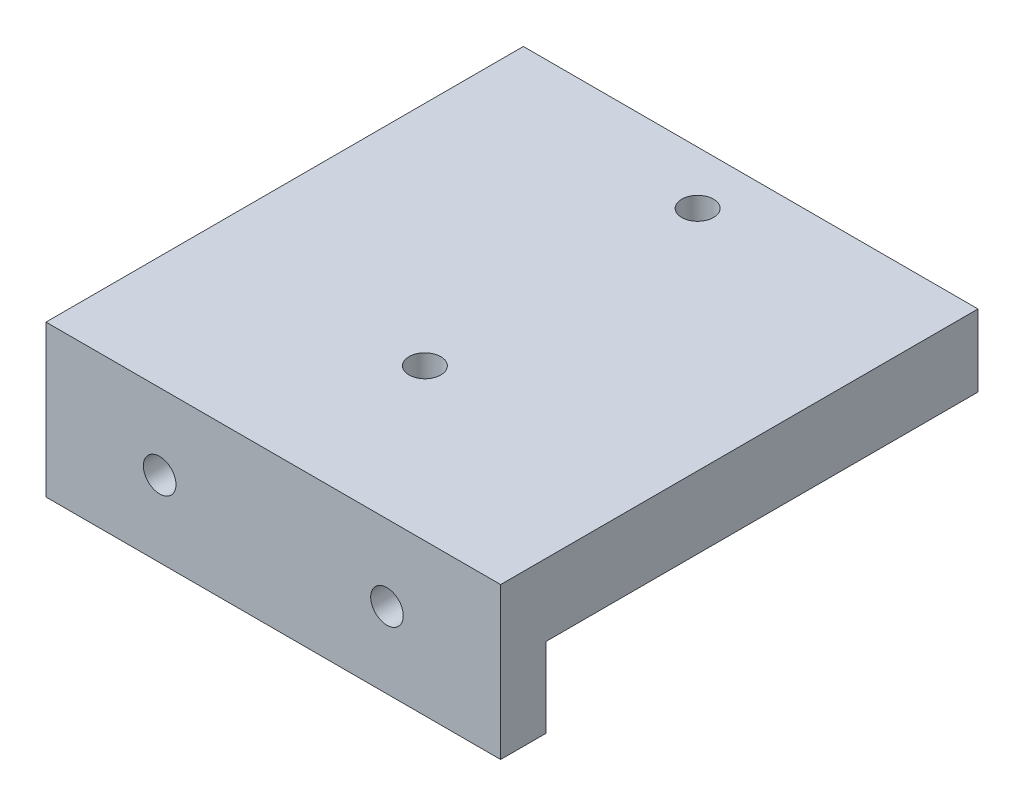
ISO-10303-21;
HEADER;
FILE_DESCRIPTION(('STEP AP214'),'2;1');
FILE_NAME('part.step','',(''),(''),'','','');
FILE_SCHEMA(('AUTOMOTIVE_DESIGN { 1 0 10303 214 1 1 1 1 }'));
ENDSEC;
DATA;
#1=APPLICATION_CONTEXT('core data for automotive mechanical design processes');
#2=APPLICATION_PROTOCOL_DEFINITION('international standard','automotive_design',2000,#1);
#3=PRODUCT_CONTEXT('',#1,'mechanical');
#4=PRODUCT('Part','Part','',(#3));
#5=PRODUCT_RELATED_PRODUCT_CATEGORY('part','',(#4));
#6=PRODUCT_DEFINITION_FORMATION('','',#4);
#7=PRODUCT_DEFINITION_CONTEXT('part definition',#1,'design');
#8=PRODUCT_DEFINITION('design','',#6,#7);
#9=PRODUCT_DEFINITION_SHAPE('','',#8);
#10=(LENGTH_UNIT() NAMED_UNIT(*) SI_UNIT(.MILLI.,.METRE.));
#11=(NAMED_UNIT(*) PLANE_ANGLE_UNIT() SI_UNIT($,.RADIAN.));
#12=(NAMED_UNIT(*) SI_UNIT($,.STERADIAN.) SOLID_ANGLE_UNIT());
#13=UNCERTAINTY_MEASURE_WITH_UNIT(LENGTH_MEASURE(1.E-05),#10,'distance_accuracy_value','');
#14=(GEOMETRIC_REPRESENTATION_CONTEXT(3) GLOBAL_UNCERTAINTY_ASSIGNED_CONTEXT((#13)) GLOBAL_UNIT_ASSIGNED_CONTEXT((#10,
#11,#12)) REPRESENTATION_CONTEXT('',''));
#15=CARTESIAN_POINT('',(0.,0.,0.));
#16=DIRECTION('',(0.,0.,1.));
#17=DIRECTION('',(1.,0.,0.));
#18=AXIS2_PLACEMENT_3D('',#15,#16,#17);
#19=CARTESIAN_POINT('',(-30.,23.5,-25.));
#20=DIRECTION('',(1.,0.,0.));
#21=DIRECTION('',(0.,0.,-1.));
#22=AXIS2_PLACEMENT_3D('',#19,#20,#21);
#23=PLANE('',#22);
#24=DIRECTION('',(0.,0.,1.));
#25=VECTOR('',#24,1.);
#26=CARTESIAN_POINT('',(-30.,14.,-25.));
#27=LINE('',#26,#25);
#28=CARTESIAN_POINT('',(-30.,14.,-25.));
#29=VERTEX_POINT('',#28);
#30=CARTESIAN_POINT('',(-30.,14.,32.));
#31=VERTEX_POINT('',#30);
#32=EDGE_CURVE('E161',#29,#31,#27,.T.);
#33=ORIENTED_EDGE('',*,*,#32,.T.);
#34=DIRECTION('',(0.,-1.,0.));
#35=VECTOR('',#34,1.);
#36=CARTESIAN_POINT('',(-30.,14.,32.));
#37=LINE('',#36,#35);
#38=CARTESIAN_POINT('',(-30.,3.5,32.));
#39=VERTEX_POINT('',#38);
#40=EDGE_CURVE('E150',#31,#39,#37,.T.);
#41=ORIENTED_EDGE('',*,*,#40,.T.);
#42=DIRECTION('',(0.,0.,1.));
#43=VECTOR('',#42,1.);
#44=CARTESIAN_POINT('',(-30.,3.5,32.));
#45=LINE('',#44,#43);
#46=CARTESIAN_POINT('',(-30.,3.5,38.));
#47=VERTEX_POINT('',#46);
#48=EDGE_CURVE('E141',#39,#47,#45,.T.);
#49=ORIENTED_EDGE('',*,*,#48,.T.);
#50=DIRECTION('',(0.,-1.,0.));
#51=VECTOR('',#50,1.);
#52=CARTESIAN_POINT('',(-30.,23.5,38.));
#53=LINE('',#52,#51);
#54=CARTESIAN_POINT('',(-30.,23.5,38.));
#55=VERTEX_POINT('',#54);
#56=EDGE_CURVE('E190',#55,#47,#53,.T.);
#57=ORIENTED_EDGE('',*,*,#56,.F.);
#58=DIRECTION('',(0.,0.,1.));
#59=VECTOR('',#58,1.);
#60=CARTESIAN_POINT('',(-30.,23.5,-25.));
#61=LINE('',#60,#59);
#62=CARTESIAN_POINT('',(-30.,23.5,-25.));
#63=VERTEX_POINT('',#62);
#64=EDGE_CURVE('E165',#63,#55,#61,.T.);
#65=ORIENTED_EDGE('',*,*,#64,.F.);
#66=DIRECTION('',(0.,-1.,0.));
#67=VECTOR('',#66,1.);
#68=CARTESIAN_POINT('',(-30.,23.5,-25.));
#69=LINE('',#68,#67);
#70=EDGE_CURVE('E172',#63,#29,#69,.T.);
#71=ORIENTED_EDGE('',*,*,#70,.T.);
#72=EDGE_LOOP('',(#33,#41,#49,#57,#65,#71));
#73=FACE_BOUND('',#72,.T.);
#74=ADVANCED_FACE('F39',(#73),#23,.F.);
#75=CARTESIAN_POINT('',(-30.,23.5,38.));
#76=DIRECTION('',(0.,0.,-1.));
#77=DIRECTION('',(-1.,0.,0.));
#78=AXIS2_PLACEMENT_3D('',#75,#76,#77);
#79=PLANE('',#78);
#80=CARTESIAN_POINT('',(15.,13.5,38.));
#81=DIRECTION('',(0.,0.,1.));
#82=DIRECTION('',(1.,0.,0.));
#83=AXIS2_PLACEMENT_3D('',#80,#81,#82);
#84=CIRCLE('',#83,2.15);
#85=CARTESIAN_POINT('',(17.15,13.5,38.));
#86=VERTEX_POINT('',#85);
#87=EDGE_CURVE('E137',#86,#86,#84,.T.);
#88=ORIENTED_EDGE('',*,*,#87,.F.);
#89=EDGE_LOOP('',(#88));
#90=FACE_BOUND('',#89,.T.);
#91=CARTESIAN_POINT('',(-15.,13.5,38.));
#92=DIRECTION('',(0.,0.,1.));
#93=DIRECTION('',(1.,0.,0.));
#94=AXIS2_PLACEMENT_3D('',#91,#92,#93);
#95=CIRCLE('',#94,2.15);
#96=CARTESIAN_POINT('',(-12.85,13.5,38.));
#97=VERTEX_POINT('',#96);
#98=EDGE_CURVE('E124',#97,#97,#95,.T.);
#99=ORIENTED_EDGE('',*,*,#98,.F.);
#100=EDGE_LOOP('',(#99));
#101=FACE_BOUND('',#100,.T.);
#102=ORIENTED_EDGE('',*,*,#56,.T.);
#103=DIRECTION('',(1.,0.,0.));
#104=VECTOR('',#103,1.);
#105=CARTESIAN_POINT('',(-30.,3.5,38.));
#106=LINE('',#105,#104);
#107=CARTESIAN_POINT('',(30.,3.5,38.));
#108=VERTEX_POINT('',#107);
#109=EDGE_CURVE('E151',#47,#108,#106,.T.);
#110=ORIENTED_EDGE('',*,*,#109,.T.);
#111=DIRECTION('',(0.,-1.,0.));
#112=VECTOR('',#111,1.);
#113=CARTESIAN_POINT('',(30.,23.5,38.));
#114=LINE('',#113,#112);
#115=CARTESIAN_POINT('',(30.,23.5,38.));
#116=VERTEX_POINT('',#115);
#117=EDGE_CURVE('E184',#116,#108,#114,.T.);
#118=ORIENTED_EDGE('',*,*,#117,.F.);
#119=DIRECTION('',(1.,0.,0.));
#120=VECTOR('',#119,1.);
#121=CARTESIAN_POINT('',(-30.,23.5,38.));
#122=LINE('',#121,#120);
#123=EDGE_CURVE('E170',#55,#116,#122,.T.);
#124=ORIENTED_EDGE('',*,*,#123,.F.);
#125=EDGE_LOOP('',(#102,#110,#118,#124));
#126=FACE_BOUND('',#125,.T.);
#127=ADVANCED_FACE('F214',(#90,#101,#126),#79,.F.);
#128=CARTESIAN_POINT('',(30.,23.5,-25.));
#129=DIRECTION('',(-1.,0.,0.));
#130=DIRECTION('',(0.,0.,1.));
#131=AXIS2_PLACEMENT_3D('',#128,#129,#130);
#132=PLANE('',#131);
#133=ORIENTED_EDGE('',*,*,#117,.T.);
#134=DIRECTION('',(0.,0.,-1.));
#135=VECTOR('',#134,1.);
#136=CARTESIAN_POINT('',(30.,3.5,32.));
#137=LINE('',#136,#135);
#138=CARTESIAN_POINT('',(30.,3.5,32.));
#139=VERTEX_POINT('',#138);
#140=EDGE_CURVE('E153',#108,#139,#137,.T.);
#141=ORIENTED_EDGE('',*,*,#140,.T.);
#142=DIRECTION('',(0.,-1.,0.));
#143=VECTOR('',#142,1.);
#144=CARTESIAN_POINT('',(30.,14.,32.));
#145=LINE('',#144,#143);
#146=CARTESIAN_POINT('',(30.,14.,32.));
#147=VERTEX_POINT('',#146);
#148=EDGE_CURVE('E158',#147,#139,#145,.T.);
#149=ORIENTED_EDGE('',*,*,#148,.F.);
#150=DIRECTION('',(0.,0.,-1.));
#151=VECTOR('',#150,1.);
#152=CARTESIAN_POINT('',(30.,14.,-25.));
#153=LINE('',#152,#151);
#154=CARTESIAN_POINT('',(30.,14.,-25.));
#155=VERTEX_POINT('',#154);
#156=EDGE_CURVE('E180',#147,#155,#153,.T.);
#157=ORIENTED_EDGE('',*,*,#156,.T.);
#158=DIRECTION('',(0.,-1.,0.));
#159=VECTOR('',#158,1.);
#160=CARTESIAN_POINT('',(30.,23.5,-25.));
#161=LINE('',#160,#159);
#162=CARTESIAN_POINT('',(30.,23.5,-25.));
#163=VERTEX_POINT('',#162);
#164=EDGE_CURVE('E185',#163,#155,#161,.T.);
#165=ORIENTED_EDGE('',*,*,#164,.F.);
#166=DIRECTION('',(0.,0.,-1.));
#167=VECTOR('',#166,1.);
#168=CARTESIAN_POINT('',(30.,23.5,-25.));
#169=LINE('',#168,#167);
#170=EDGE_CURVE('E167',#116,#163,#169,.T.);
#171=ORIENTED_EDGE('',*,*,#170,.F.);
#172=EDGE_LOOP('',(#133,#141,#149,#157,#165,#171));
#173=FACE_BOUND('',#172,.T.);
#174=ADVANCED_FACE('F198',(#173),#132,.F.);
#175=CARTESIAN_POINT('',(-30.,23.5,-25.));
#176=DIRECTION('',(0.,0.,1.));
#177=DIRECTION('',(1.,0.,0.));
#178=AXIS2_PLACEMENT_3D('',#175,#176,#177);
#179=PLANE('',#178);
#180=DIRECTION('',(-1.,0.,0.));
#181=VECTOR('',#180,1.);
#182=CARTESIAN_POINT('',(-30.,14.,-25.));
#183=LINE('',#182,#181);
#184=EDGE_CURVE('E166',#155,#29,#183,.T.);
#185=ORIENTED_EDGE('',*,*,#184,.T.);
#186=ORIENTED_EDGE('',*,*,#70,.F.);
#187=DIRECTION('',(-1.,0.,0.));
#188=VECTOR('',#187,1.);
#189=CARTESIAN_POINT('',(-30.,23.5,-25.));
#190=LINE('',#189,#188);
#191=EDGE_CURVE('E175',#163,#63,#190,.T.);
#192=ORIENTED_EDGE('',*,*,#191,.F.);
#193=ORIENTED_EDGE('',*,*,#164,.T.);
#194=EDGE_LOOP('',(#185,#186,#192,#193));
#195=FACE_BOUND('',#194,.T.);
#196=ADVANCED_FACE('F205',(#195),#179,.F.);
#197=CARTESIAN_POINT('',(0.,23.5,0.));
#198=DIRECTION('',(0.,1.,0.));
#199=DIRECTION('',(0.,0.,1.));
#200=AXIS2_PLACEMENT_3D('',#197,#198,#199);
#201=PLANE('',#200);
#202=CARTESIAN_POINT('',(0.,23.5,18.));
#203=DIRECTION('',(0.,1.,0.));
#204=DIRECTION('',(0.,0.,1.));
#205=AXIS2_PLACEMENT_3D('',#202,#203,#204);
#206=CIRCLE('',#205,2.1);
#207=CARTESIAN_POINT('',(0.,23.5,20.1));
#208=VERTEX_POINT('',#207);
#209=EDGE_CURVE('E121',#208,#208,#206,.T.);
#210=ORIENTED_EDGE('',*,*,#209,.F.);
#211=EDGE_LOOP('',(#210));
#212=FACE_BOUND('',#211,.T.);
#213=CARTESIAN_POINT('',(0.,23.5,-18.));
#214=DIRECTION('',(0.,1.,0.));
#215=DIRECTION('',(0.,0.,1.));
#216=AXIS2_PLACEMENT_3D('',#213,#214,#215);
#217=CIRCLE('',#216,2.1);
#218=CARTESIAN_POINT('',(0.,23.5,-15.9));
#219=VERTEX_POINT('',#218);
#220=EDGE_CURVE('E287',#219,#219,#217,.T.);
#221=ORIENTED_EDGE('',*,*,#220,.F.);
#222=EDGE_LOOP('',(#221));
#223=FACE_BOUND('',#222,.T.);
#224=ORIENTED_EDGE('',*,*,#64,.T.);
#225=ORIENTED_EDGE('',*,*,#123,.T.);
#226=ORIENTED_EDGE('',*,*,#170,.T.);
#227=ORIENTED_EDGE('',*,*,#191,.T.);
#228=EDGE_LOOP('',(#224,#225,#226,#227));
#229=FACE_BOUND('',#228,.T.);
#230=ADVANCED_FACE('F210',(#212,#223,#229),#201,.T.);
#231=CARTESIAN_POINT('',(0.,14.,0.));
#232=DIRECTION('',(0.,1.,0.));
#233=DIRECTION('',(0.,0.,1.));
#234=AXIS2_PLACEMENT_3D('',#231,#232,#233);
#235=PLANE('',#234);
#236=CARTESIAN_POINT('',(18.,14.,0.));
#237=DIRECTION('',(0.,1.,0.));
#238=DIRECTION('',(0.,0.,1.));
#239=AXIS2_PLACEMENT_3D('',#236,#237,#238);
#240=CIRCLE('',#239,5.);
#241=CARTESIAN_POINT('',(18.,14.,5.));
#242=VERTEX_POINT('',#241);
#243=EDGE_CURVE('E289',#242,#242,#240,.T.);
#244=ORIENTED_EDGE('',*,*,#243,.T.);
#245=EDGE_LOOP('',(#244));
#246=FACE_BOUND('',#245,.T.);
#247=CARTESIAN_POINT('',(-18.,14.,0.));
#248=DIRECTION('',(0.,1.,0.));
#249=DIRECTION('',(0.,0.,1.));
#250=AXIS2_PLACEMENT_3D('',#247,#248,#249);
#251=CIRCLE('',#250,5.);
#252=CARTESIAN_POINT('',(-18.,14.,5.));
#253=VERTEX_POINT('',#252);
#254=EDGE_CURVE('E291',#253,#253,#251,.T.);
#255=ORIENTED_EDGE('',*,*,#254,.T.);
#256=EDGE_LOOP('',(#255));
#257=FACE_BOUND('',#256,.T.);
#258=CARTESIAN_POINT('',(0.,14.,18.));
#259=DIRECTION('',(0.,1.,0.));
#260=DIRECTION('',(0.,0.,1.));
#261=AXIS2_PLACEMENT_3D('',#258,#259,#260);
#262=CIRCLE('',#261,2.1);
#263=CARTESIAN_POINT('',(0.,14.,20.1));
#264=VERTEX_POINT('',#263);
#265=EDGE_CURVE('E303',#264,#264,#262,.T.);
#266=ORIENTED_EDGE('',*,*,#265,.T.);
#267=EDGE_LOOP('',(#266));
#268=FACE_BOUND('',#267,.T.);
#269=CARTESIAN_POINT('',(0.,14.,-18.));
#270=DIRECTION('',(0.,1.,0.));
#271=DIRECTION('',(0.,0.,1.));
#272=AXIS2_PLACEMENT_3D('',#269,#270,#271);
#273=CIRCLE('',#272,2.1);
#274=CARTESIAN_POINT('',(0.,14.,-15.9));
#275=VERTEX_POINT('',#274);
#276=EDGE_CURVE('E288',#275,#275,#273,.T.);
#277=ORIENTED_EDGE('',*,*,#276,.T.);
#278=EDGE_LOOP('',(#277));
#279=FACE_BOUND('',#278,.T.);
#280=DIRECTION('',(1.,0.,0.));
#281=VECTOR('',#280,1.);
#282=CARTESIAN_POINT('',(0.,14.,30.));
#283=LINE('',#282,#281);
#284=CARTESIAN_POINT('',(12.9089476333674,14.,30.));
#285=VERTEX_POINT('',#284);
#286=CARTESIAN_POINT('',(17.0910523666326,14.,30.));
#287=VERTEX_POINT('',#286);
#288=EDGE_CURVE('E11',#285,#287,#283,.T.);
#289=ORIENTED_EDGE('',*,*,#288,.F.);
#290=DIRECTION('',(0.,0.,1.));
#291=VECTOR('',#290,1.);
#292=CARTESIAN_POINT('',(12.9089476333674,14.,30.));
#293=LINE('',#292,#291);
#294=CARTESIAN_POINT('',(12.9089476333674,14.,32.));
#295=VERTEX_POINT('',#294);
#296=EDGE_CURVE('E142',#285,#295,#293,.T.);
#297=ORIENTED_EDGE('',*,*,#296,.T.);
#298=DIRECTION('',(-1.,0.,0.));
#299=VECTOR('',#298,1.);
#300=CARTESIAN_POINT('',(-30.,14.,32.));
#301=LINE('',#300,#299);
#302=CARTESIAN_POINT('',(-12.9089476333674,14.,32.));
#303=VERTEX_POINT('',#302);
#304=EDGE_CURVE('E131',#295,#303,#301,.T.);
#305=ORIENTED_EDGE('',*,*,#304,.T.);
#306=DIRECTION('',(0.,0.,1.));
#307=VECTOR('',#306,1.);
#308=CARTESIAN_POINT('',(-12.9089476333674,14.,30.));
#309=LINE('',#308,#307);
#310=CARTESIAN_POINT('',(-12.9089476333674,14.,30.));
#311=VERTEX_POINT('',#310);
#312=EDGE_CURVE('E52',#303,#311,#309,.F.);
#313=ORIENTED_EDGE('',*,*,#312,.T.);
#314=DIRECTION('',(1.,0.,0.));
#315=VECTOR('',#314,1.);
#316=CARTESIAN_POINT('',(0.,14.,30.));
#317=LINE('',#316,#315);
#318=CARTESIAN_POINT('',(-17.0910523666326,14.,30.));
#319=VERTEX_POINT('',#318);
#320=EDGE_CURVE('E46',#319,#311,#317,.T.);
#321=ORIENTED_EDGE('',*,*,#320,.F.);
#322=DIRECTION('',(0.,0.,1.));
#323=VECTOR('',#322,1.);
#324=CARTESIAN_POINT('',(-17.0910523666326,14.,30.));
#325=LINE('',#324,#323);
#326=CARTESIAN_POINT('',(-17.0910523666326,14.,32.));
#327=VERTEX_POINT('',#326);
#328=EDGE_CURVE('E125',#319,#327,#325,.T.);
#329=ORIENTED_EDGE('',*,*,#328,.T.);
#330=EDGE_CURVE('E149',#327,#31,#301,.T.);
#331=ORIENTED_EDGE('',*,*,#330,.T.);
#332=ORIENTED_EDGE('',*,*,#32,.F.);
#333=ORIENTED_EDGE('',*,*,#184,.F.);
#334=ORIENTED_EDGE('',*,*,#156,.F.);
#335=CARTESIAN_POINT('',(17.0910523666326,14.,32.));
#336=VERTEX_POINT('',#335);
#337=EDGE_CURVE('E144',#147,#336,#301,.T.);
#338=ORIENTED_EDGE('',*,*,#337,.T.);
#339=DIRECTION('',(0.,0.,1.));
#340=VECTOR('',#339,1.);
#341=CARTESIAN_POINT('',(17.0910523666326,14.,30.));
#342=LINE('',#341,#340);
#343=EDGE_CURVE('E62',#336,#287,#342,.F.);
#344=ORIENTED_EDGE('',*,*,#343,.T.);
#345=EDGE_LOOP('',(#289,#297,#305,#313,#321,#329,#331,#332,#333,#334,#338,#344));
#346=FACE_BOUND('',#345,.T.);
#347=ADVANCED_FACE('F129',(#246,#257,#268,#279,#346),#235,.F.);
#348=CARTESIAN_POINT('',(-30.,14.,32.));
#349=DIRECTION('',(0.,0.,1.));
#350=DIRECTION('',(1.,0.,0.));
#351=AXIS2_PLACEMENT_3D('',#348,#349,#350);
#352=PLANE('',#351);
#353=ORIENTED_EDGE('',*,*,#304,.F.);
#354=CARTESIAN_POINT('',(15.,13.5,32.));
#355=DIRECTION('',(0.,0.,1.));
#356=DIRECTION('',(1.,0.,0.));
#357=AXIS2_PLACEMENT_3D('',#354,#355,#356);
#358=CIRCLE('',#357,2.15);
#359=EDGE_CURVE('E119',#295,#336,#358,.T.);
#360=ORIENTED_EDGE('',*,*,#359,.T.);
#361=ORIENTED_EDGE('',*,*,#337,.F.);
#362=ORIENTED_EDGE('',*,*,#148,.T.);
#363=DIRECTION('',(-1.,0.,0.));
#364=VECTOR('',#363,1.);
#365=CARTESIAN_POINT('',(-30.,3.5,32.));
#366=LINE('',#365,#364);
#367=EDGE_CURVE('E157',#139,#39,#366,.T.);
#368=ORIENTED_EDGE('',*,*,#367,.T.);
#369=ORIENTED_EDGE('',*,*,#40,.F.);
#370=ORIENTED_EDGE('',*,*,#330,.F.);
#371=CARTESIAN_POINT('',(-15.,13.5,32.));
#372=DIRECTION('',(0.,0.,1.));
#373=DIRECTION('',(1.,0.,0.));
#374=AXIS2_PLACEMENT_3D('',#371,#372,#373);
#375=CIRCLE('',#374,2.15);
#376=EDGE_CURVE('E186',#327,#303,#375,.T.);
#377=ORIENTED_EDGE('',*,*,#376,.T.);
#378=EDGE_LOOP('',(#353,#360,#361,#362,#368,#369,#370,#377));
#379=FACE_BOUND('',#378,.T.);
#380=ADVANCED_FACE('F194',(#379),#352,.F.);
#381=CARTESIAN_POINT('',(0.,3.5,0.));
#382=DIRECTION('',(0.,1.,0.));
#383=DIRECTION('',(0.,0.,1.));
#384=AXIS2_PLACEMENT_3D('',#381,#382,#383);
#385=PLANE('',#384);
#386=ORIENTED_EDGE('',*,*,#48,.F.);
#387=ORIENTED_EDGE('',*,*,#367,.F.);
#388=ORIENTED_EDGE('',*,*,#140,.F.);
#389=ORIENTED_EDGE('',*,*,#109,.F.);
#390=EDGE_LOOP('',(#386,#387,#388,#389));
#391=FACE_BOUND('',#390,.T.);
#392=ADVANCED_FACE('F217',(#391),#385,.F.);
#393=CARTESIAN_POINT('',(-15.,13.5,30.));
#394=DIRECTION('',(0.,0.,1.));
#395=DIRECTION('',(1.,0.,0.));
#396=AXIS2_PLACEMENT_3D('',#393,#394,#395);
#397=PLANE('',#396);
#398=ORIENTED_EDGE('',*,*,#320,.T.);
#399=CARTESIAN_POINT('',(-15.,13.5,30.));
#400=DIRECTION('',(0.,0.,1.));
#401=DIRECTION('',(1.,0.,0.));
#402=AXIS2_PLACEMENT_3D('',#399,#400,#401);
#403=CIRCLE('',#402,2.15);
#404=EDGE_CURVE('E120',#311,#319,#403,.T.);
#405=ORIENTED_EDGE('',*,*,#404,.T.);
#406=EDGE_LOOP('',(#398,#405));
#407=FACE_BOUND('',#406,.T.);
#408=ADVANCED_FACE('F116',(#407),#397,.T.);
#409=CARTESIAN_POINT('',(-15.,13.5,30.));
#410=DIRECTION('',(0.,0.,1.));
#411=DIRECTION('',(1.,0.,0.));
#412=AXIS2_PLACEMENT_3D('',#409,#410,#411);
#413=CYLINDRICAL_SURFACE('',#412,2.15);
#414=ORIENTED_EDGE('',*,*,#98,.T.);
#415=EDGE_LOOP('',(#414));
#416=FACE_BOUND('',#415,.T.);
#417=ORIENTED_EDGE('',*,*,#404,.F.);
#418=ORIENTED_EDGE('',*,*,#312,.F.);
#419=ORIENTED_EDGE('',*,*,#376,.F.);
#420=ORIENTED_EDGE('',*,*,#328,.F.);
#421=EDGE_LOOP('',(#417,#418,#419,#420));
#422=FACE_BOUND('',#421,.T.);
#423=ADVANCED_FACE('F122',(#416,#422),#413,.F.);
#424=CARTESIAN_POINT('',(15.,13.5,30.));
#425=DIRECTION('',(0.,0.,1.));
#426=DIRECTION('',(1.,0.,0.));
#427=AXIS2_PLACEMENT_3D('',#424,#425,#426);
#428=PLANE('',#427);
#429=ORIENTED_EDGE('',*,*,#288,.T.);
#430=CARTESIAN_POINT('',(15.,13.5,30.));
#431=DIRECTION('',(0.,0.,1.));
#432=DIRECTION('',(1.,0.,0.));
#433=AXIS2_PLACEMENT_3D('',#430,#431,#432);
#434=CIRCLE('',#433,2.15);
#435=EDGE_CURVE('E132',#287,#285,#434,.T.);
#436=ORIENTED_EDGE('',*,*,#435,.T.);
#437=EDGE_LOOP('',(#429,#436));
#438=FACE_BOUND('',#437,.T.);
#439=ADVANCED_FACE('F248',(#438),#428,.T.);
#440=CARTESIAN_POINT('',(15.,13.5,30.));
#441=DIRECTION('',(0.,0.,1.));
#442=DIRECTION('',(1.,0.,0.));
#443=AXIS2_PLACEMENT_3D('',#440,#441,#442);
#444=CYLINDRICAL_SURFACE('',#443,2.15);
#445=ORIENTED_EDGE('',*,*,#87,.T.);
#446=EDGE_LOOP('',(#445));
#447=FACE_BOUND('',#446,.T.);
#448=ORIENTED_EDGE('',*,*,#435,.F.);
#449=ORIENTED_EDGE('',*,*,#343,.F.);
#450=ORIENTED_EDGE('',*,*,#359,.F.);
#451=ORIENTED_EDGE('',*,*,#296,.F.);
#452=EDGE_LOOP('',(#448,#449,#450,#451));
#453=FACE_BOUND('',#452,.T.);
#454=ADVANCED_FACE('F252',(#447,#453),#444,.F.);
#455=CARTESIAN_POINT('',(0.,23.5,-18.));
#456=DIRECTION('',(0.,-1.,0.));
#457=DIRECTION('',(0.,0.,-1.));
#458=AXIS2_PLACEMENT_3D('',#455,#456,#457);
#459=CYLINDRICAL_SURFACE('',#458,2.1);
#460=ORIENTED_EDGE('',*,*,#220,.T.);
#461=EDGE_LOOP('',(#460));
#462=FACE_BOUND('',#461,.T.);
#463=ORIENTED_EDGE('',*,*,#276,.F.);
#464=EDGE_LOOP('',(#463));
#465=FACE_BOUND('',#464,.T.);
#466=ADVANCED_FACE('F251',(#462,#465),#459,.F.);
#467=CARTESIAN_POINT('',(0.,23.5,18.));
#468=DIRECTION('',(0.,-1.,0.));
#469=DIRECTION('',(0.,0.,-1.));
#470=AXIS2_PLACEMENT_3D('',#467,#468,#469);
#471=CYLINDRICAL_SURFACE('',#470,2.1);
#472=ORIENTED_EDGE('',*,*,#209,.T.);
#473=EDGE_LOOP('',(#472));
#474=FACE_BOUND('',#473,.T.);
#475=ORIENTED_EDGE('',*,*,#265,.F.);
#476=EDGE_LOOP('',(#475));
#477=FACE_BOUND('',#476,.T.);
#478=ADVANCED_FACE('F261',(#474,#477),#471,.F.);
#479=CARTESIAN_POINT('',(-18.,19.,0.));
#480=DIRECTION('',(0.,-1.,0.));
#481=DIRECTION('',(0.,0.,-1.));
#482=AXIS2_PLACEMENT_3D('',#479,#480,#481);
#483=CYLINDRICAL_SURFACE('',#482,5.);
#484=CARTESIAN_POINT('',(-18.,19.,0.));
#485=DIRECTION('',(0.,1.,0.));
#486=DIRECTION('',(0.,0.,1.));
#487=AXIS2_PLACEMENT_3D('',#484,#485,#486);
#488=CIRCLE('',#487,5.);
#489=CARTESIAN_POINT('',(-18.,19.,5.));
#490=VERTEX_POINT('',#489);
#491=EDGE_CURVE('E296',#490,#490,#488,.T.);
#492=ORIENTED_EDGE('',*,*,#491,.T.);
#493=EDGE_LOOP('',(#492));
#494=FACE_BOUND('',#493,.T.);
#495=ORIENTED_EDGE('',*,*,#254,.F.);
#496=EDGE_LOOP('',(#495));
#497=FACE_BOUND('',#496,.T.);
#498=ADVANCED_FACE('F265',(#494,#497),#483,.F.);
#499=CARTESIAN_POINT('',(-18.,19.,0.));
#500=DIRECTION('',(0.,1.,0.));
#501=DIRECTION('',(0.,0.,1.));
#502=AXIS2_PLACEMENT_3D('',#499,#500,#501);
#503=PLANE('',#502);
#504=ORIENTED_EDGE('',*,*,#491,.F.);
#505=EDGE_LOOP('',(#504));
#506=FACE_BOUND('',#505,.T.);
#507=ADVANCED_FACE('F269',(#506),#503,.F.);
#508=CARTESIAN_POINT('',(18.,19.,0.));
#509=DIRECTION('',(0.,-1.,0.));
#510=DIRECTION('',(0.,0.,-1.));
#511=AXIS2_PLACEMENT_3D('',#508,#509,#510);
#512=CYLINDRICAL_SURFACE('',#511,5.);
#513=CARTESIAN_POINT('',(18.,19.,0.));
#514=DIRECTION('',(0.,1.,0.));
#515=DIRECTION('',(0.,0.,1.));
#516=AXIS2_PLACEMENT_3D('',#513,#514,#515);
#517=CIRCLE('',#516,5.);
#518=CARTESIAN_POINT('',(18.,19.,5.));
#519=VERTEX_POINT('',#518);
#520=EDGE_CURVE('E285',#519,#519,#517,.T.);
#521=ORIENTED_EDGE('',*,*,#520,.T.);
#522=EDGE_LOOP('',(#521));
#523=FACE_BOUND('',#522,.T.);
#524=ORIENTED_EDGE('',*,*,#243,.F.);
#525=EDGE_LOOP('',(#524));
#526=FACE_BOUND('',#525,.T.);
#527=ADVANCED_FACE('F268',(#523,#526),#512,.F.);
#528=CARTESIAN_POINT('',(18.,19.,0.));
#529=DIRECTION('',(0.,1.,0.));
#530=DIRECTION('',(0.,0.,1.));
#531=AXIS2_PLACEMENT_3D('',#528,#529,#530);
#532=PLANE('',#531);
#533=ORIENTED_EDGE('',*,*,#520,.F.);
#534=EDGE_LOOP('',(#533));
#535=FACE_BOUND('',#534,.T.);
#536=ADVANCED_FACE('F280',(#535),#532,.F.);
#537=CLOSED_SHELL('',(#74,#127,#174,#196,#230,#347,#380,#392,#408,#423,#439,#454,#466,#478,#498,
#507,#527,#536));
#538=MANIFOLD_SOLID_BREP('B2',#537);
#539=ADVANCED_BREP_SHAPE_REPRESENTATION('',(#18,#538),#14);
#540=SHAPE_DEFINITION_REPRESENTATION(#9,#539);
ENDSEC;
END-ISO-10303-21;
